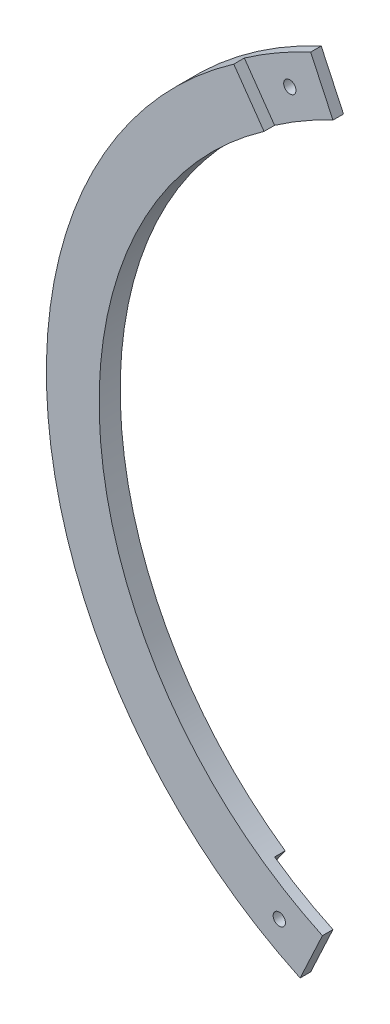
ISO-10303-21;
HEADER;
FILE_DESCRIPTION(('STEP AP214'),'2;1');
FILE_NAME('part.step','',(''),(''),'','','');
FILE_SCHEMA(('AUTOMOTIVE_DESIGN { 1 0 10303 214 1 1 1 1 }'));
ENDSEC;
DATA;
#1=APPLICATION_CONTEXT('core data for automotive mechanical design processes');
#2=APPLICATION_PROTOCOL_DEFINITION('international standard','automotive_design',2000,#1);
#3=PRODUCT_CONTEXT('',#1,'mechanical');
#4=PRODUCT('Part','Part','',(#3));
#5=PRODUCT_RELATED_PRODUCT_CATEGORY('part','',(#4));
#6=PRODUCT_DEFINITION_FORMATION('','',#4);
#7=PRODUCT_DEFINITION_CONTEXT('part definition',#1,'design');
#8=PRODUCT_DEFINITION('design','',#6,#7);
#9=PRODUCT_DEFINITION_SHAPE('','',#8);
#10=(LENGTH_UNIT() NAMED_UNIT(*) SI_UNIT(.MILLI.,.METRE.));
#11=(NAMED_UNIT(*) PLANE_ANGLE_UNIT() SI_UNIT($,.RADIAN.));
#12=(NAMED_UNIT(*) SI_UNIT($,.STERADIAN.) SOLID_ANGLE_UNIT());
#13=UNCERTAINTY_MEASURE_WITH_UNIT(LENGTH_MEASURE(1.E-05),#10,'distance_accuracy_value','');
#14=(GEOMETRIC_REPRESENTATION_CONTEXT(3) GLOBAL_UNCERTAINTY_ASSIGNED_CONTEXT((#13)) GLOBAL_UNIT_ASSIGNED_CONTEXT((#10,
#11,#12)) REPRESENTATION_CONTEXT('',''));
#15=CARTESIAN_POINT('',(0.,0.,0.));
#16=DIRECTION('',(0.,0.,1.));
#17=DIRECTION('',(1.,0.,0.));
#18=AXIS2_PLACEMENT_3D('',#15,#16,#17);
#19=CARTESIAN_POINT('',(0.,0.,6.));
#20=DIRECTION('',(0.,0.,-1.));
#21=DIRECTION('',(-1.,0.,0.));
#22=AXIS2_PLACEMENT_3D('',#19,#20,#21);
#23=CYLINDRICAL_SURFACE('',#22,125.);
#24=CARTESIAN_POINT('',(0.,0.,0.));
#25=DIRECTION('',(0.,0.,1.));
#26=DIRECTION('',(1.,0.,0.));
#27=AXIS2_PLACEMENT_3D('',#24,#25,#26);
#28=CIRCLE('',#27,125.);
#29=CARTESIAN_POINT('',(-52.827282717588,113.288473379581,0.));
#30=VERTEX_POINT('',#29);
#31=CARTESIAN_POINT('',(-71.6970545438808,-102.394005536124,0.));
#32=VERTEX_POINT('',#31);
#33=EDGE_CURVE('E136',#30,#32,#28,.T.);
#34=ORIENTED_EDGE('',*,*,#33,.T.);
#35=DIRECTION('',(0.,0.,-1.));
#36=VECTOR('',#35,1.);
#37=CARTESIAN_POINT('',(-71.6970545438808,-102.394005536124,3.));
#38=LINE('',#37,#36);
#39=CARTESIAN_POINT('',(-71.6970545438808,-102.394005536124,3.));
#40=VERTEX_POINT('',#39);
#41=EDGE_CURVE('E52',#40,#32,#38,.T.);
#42=ORIENTED_EDGE('',*,*,#41,.F.);
#43=CARTESIAN_POINT('',(0.,0.,3.));
#44=DIRECTION('',(0.,0.,-1.));
#45=DIRECTION('',(1.,0.,0.));
#46=AXIS2_PLACEMENT_3D('',#43,#44,#45);
#47=CIRCLE('',#46,125.);
#48=CARTESIAN_POINT('',(-52.827282717588,-113.288473379581,3.));
#49=VERTEX_POINT('',#48);
#50=EDGE_CURVE('E121',#49,#40,#47,.T.);
#51=ORIENTED_EDGE('',*,*,#50,.F.);
#52=DIRECTION('',(0.,0.,-1.));
#53=VECTOR('',#52,1.);
#54=CARTESIAN_POINT('',(-52.8272827175879,-113.288473379581,6.));
#55=LINE('',#54,#53);
#56=CARTESIAN_POINT('',(-52.8272827175879,-113.288473379581,6.));
#57=VERTEX_POINT('',#56);
#58=EDGE_CURVE('E11',#57,#49,#55,.T.);
#59=ORIENTED_EDGE('',*,*,#58,.F.);
#60=CARTESIAN_POINT('',(0.,0.,6.));
#61=DIRECTION('',(0.,0.,1.));
#62=DIRECTION('',(1.,0.,0.));
#63=AXIS2_PLACEMENT_3D('',#60,#61,#62);
#64=CIRCLE('',#63,125.);
#65=CARTESIAN_POINT('',(-71.6970545438815,102.394005536123,6.));
#66=VERTEX_POINT('',#65);
#67=EDGE_CURVE('E153',#66,#57,#64,.T.);
#68=ORIENTED_EDGE('',*,*,#67,.F.);
#69=DIRECTION('',(0.,0.,1.));
#70=VECTOR('',#69,1.);
#71=CARTESIAN_POINT('',(-71.6970545438814,102.394005536124,3.));
#72=LINE('',#71,#70);
#73=CARTESIAN_POINT('',(-71.6970545438814,102.394005536124,3.));
#74=VERTEX_POINT('',#73);
#75=EDGE_CURVE('E60',#74,#66,#72,.T.);
#76=ORIENTED_EDGE('',*,*,#75,.F.);
#77=CARTESIAN_POINT('',(0.,0.,3.));
#78=DIRECTION('',(0.,0.,1.));
#79=DIRECTION('',(-1.,0.,0.));
#80=AXIS2_PLACEMENT_3D('',#77,#78,#79);
#81=CIRCLE('',#80,125.);
#82=CARTESIAN_POINT('',(-52.827282717588,113.288473379581,3.));
#83=VERTEX_POINT('',#82);
#84=EDGE_CURVE('E169',#83,#74,#81,.T.);
#85=ORIENTED_EDGE('',*,*,#84,.F.);
#86=DIRECTION('',(0.,0.,-1.));
#87=VECTOR('',#86,1.);
#88=CARTESIAN_POINT('',(-52.827282717588,113.288473379581,6.));
#89=LINE('',#88,#87);
#90=EDGE_CURVE('E130',#83,#30,#89,.T.);
#91=ORIENTED_EDGE('',*,*,#90,.T.);
#92=EDGE_LOOP('',(#34,#42,#51,#59,#68,#76,#85,#91));
#93=FACE_BOUND('',#92,.T.);
#94=ADVANCED_FACE('F36',(#93),#23,.T.);
#95=CARTESIAN_POINT('',(-46.4880087914774,-99.6938565740313,6.));
#96=DIRECTION('',(-0.906307787036648,0.422618261740704,0.));
#97=DIRECTION('',(-0.422618261740704,-0.906307787036648,0.));
#98=AXIS2_PLACEMENT_3D('',#95,#96,#97);
#99=PLANE('',#98);
#100=ORIENTED_EDGE('',*,*,#58,.T.);
#101=DIRECTION('',(-0.422618261740699,-0.90630778703665,0.));
#102=VECTOR('',#101,1.);
#103=CARTESIAN_POINT('',(-46.4880087914774,-99.6938565740313,3.));
#104=LINE('',#103,#102);
#105=CARTESIAN_POINT('',(-46.4880087914774,-99.6938565740313,3.));
#106=VERTEX_POINT('',#105);
#107=EDGE_CURVE('E107',#106,#49,#104,.T.);
#108=ORIENTED_EDGE('',*,*,#107,.F.);
#109=DIRECTION('',(0.,0.,-1.));
#110=VECTOR('',#109,1.);
#111=CARTESIAN_POINT('',(-46.4880087914774,-99.6938565740313,6.));
#112=LINE('',#111,#110);
#113=CARTESIAN_POINT('',(-46.4880087914774,-99.6938565740313,6.));
#114=VERTEX_POINT('',#113);
#115=EDGE_CURVE('E44',#114,#106,#112,.T.);
#116=ORIENTED_EDGE('',*,*,#115,.F.);
#117=DIRECTION('',(0.422618261740704,0.906307787036648,0.));
#118=VECTOR('',#117,1.);
#119=CARTESIAN_POINT('',(-46.4880087914774,-99.6938565740313,6.));
#120=LINE('',#119,#118);
#121=EDGE_CURVE('E155',#57,#114,#120,.T.);
#122=ORIENTED_EDGE('',*,*,#121,.F.);
#123=EDGE_LOOP('',(#100,#108,#116,#122));
#124=FACE_BOUND('',#123,.T.);
#125=ADVANCED_FACE('F117',(#124),#99,.F.);
#126=CARTESIAN_POINT('',(0.,0.,6.));
#127=DIRECTION('',(0.,0.,-1.));
#128=DIRECTION('',(-1.,0.,0.));
#129=AXIS2_PLACEMENT_3D('',#126,#127,#128);
#130=CYLINDRICAL_SURFACE('',#129,110.);
#131=CARTESIAN_POINT('',(0.,0.,3.));
#132=DIRECTION('',(0.,0.,1.));
#133=DIRECTION('',(1.,0.,0.));
#134=AXIS2_PLACEMENT_3D('',#131,#132,#133);
#135=CIRCLE('',#134,110.);
#136=CARTESIAN_POINT('',(-63.0934079986151,-90.1067248717891,3.));
#137=VERTEX_POINT('',#136);
#138=EDGE_CURVE('E103',#137,#106,#135,.T.);
#139=ORIENTED_EDGE('',*,*,#138,.F.);
#140=DIRECTION('',(0.,0.,-1.));
#141=VECTOR('',#140,1.);
#142=CARTESIAN_POINT('',(-63.0934079986151,-90.1067248717891,3.));
#143=LINE('',#142,#141);
#144=CARTESIAN_POINT('',(-63.0934079986151,-90.1067248717891,0.));
#145=VERTEX_POINT('',#144);
#146=EDGE_CURVE('E179',#137,#145,#143,.T.);
#147=ORIENTED_EDGE('',*,*,#146,.T.);
#148=CARTESIAN_POINT('',(0.,0.,0.));
#149=DIRECTION('',(0.,0.,-1.));
#150=DIRECTION('',(1.,0.,0.));
#151=AXIS2_PLACEMENT_3D('',#148,#149,#150);
#152=CIRCLE('',#151,110.);
#153=CARTESIAN_POINT('',(-46.4880087914775,99.6938565740312,0.));
#154=VERTEX_POINT('',#153);
#155=EDGE_CURVE('E161',#145,#154,#152,.T.);
#156=ORIENTED_EDGE('',*,*,#155,.T.);
#157=DIRECTION('',(0.,0.,-1.));
#158=VECTOR('',#157,1.);
#159=CARTESIAN_POINT('',(-46.4880087914775,99.6938565740312,6.));
#160=LINE('',#159,#158);
#161=CARTESIAN_POINT('',(-46.4880087914775,99.6938565740312,3.));
#162=VERTEX_POINT('',#161);
#163=EDGE_CURVE('E127',#162,#154,#160,.T.);
#164=ORIENTED_EDGE('',*,*,#163,.F.);
#165=CARTESIAN_POINT('',(0.,0.,3.));
#166=DIRECTION('',(0.,0.,-1.));
#167=DIRECTION('',(1.,0.,0.));
#168=AXIS2_PLACEMENT_3D('',#165,#166,#167);
#169=CIRCLE('',#168,110.);
#170=CARTESIAN_POINT('',(-63.0934079986156,90.1067248717887,3.));
#171=VERTEX_POINT('',#170);
#172=EDGE_CURVE('E178',#171,#162,#169,.T.);
#173=ORIENTED_EDGE('',*,*,#172,.F.);
#174=DIRECTION('',(0.,0.,1.));
#175=VECTOR('',#174,1.);
#176=CARTESIAN_POINT('',(-63.0934079986156,90.1067248717887,3.));
#177=LINE('',#176,#175);
#178=CARTESIAN_POINT('',(-63.0934079986156,90.1067248717887,6.));
#179=VERTEX_POINT('',#178);
#180=EDGE_CURVE('E140',#171,#179,#177,.T.);
#181=ORIENTED_EDGE('',*,*,#180,.T.);
#182=CARTESIAN_POINT('',(0.,0.,6.));
#183=DIRECTION('',(0.,0.,-1.));
#184=DIRECTION('',(1.,0.,0.));
#185=AXIS2_PLACEMENT_3D('',#182,#183,#184);
#186=CIRCLE('',#185,110.);
#187=EDGE_CURVE('E126',#114,#179,#186,.T.);
#188=ORIENTED_EDGE('',*,*,#187,.F.);
#189=ORIENTED_EDGE('',*,*,#115,.T.);
#190=EDGE_LOOP('',(#139,#147,#156,#164,#173,#181,#188,#189));
#191=FACE_BOUND('',#190,.T.);
#192=ADVANCED_FACE('F123',(#191),#130,.F.);
#193=CARTESIAN_POINT('',(-46.4880087914775,99.6938565740312,6.));
#194=DIRECTION('',(-0.906307787036648,-0.422618261740704,0.));
#195=DIRECTION('',(0.422618261740704,-0.906307787036648,0.));
#196=AXIS2_PLACEMENT_3D('',#193,#194,#195);
#197=PLANE('',#196);
#198=ORIENTED_EDGE('',*,*,#90,.F.);
#199=DIRECTION('',(-0.422618261740704,0.906307787036648,0.));
#200=VECTOR('',#199,1.);
#201=CARTESIAN_POINT('',(-52.827282717588,113.288473379581,3.));
#202=LINE('',#201,#200);
#203=EDGE_CURVE('E147',#162,#83,#202,.T.);
#204=ORIENTED_EDGE('',*,*,#203,.F.);
#205=ORIENTED_EDGE('',*,*,#163,.T.);
#206=DIRECTION('',(-0.422618261740704,0.906307787036648,0.));
#207=VECTOR('',#206,1.);
#208=CARTESIAN_POINT('',(-46.4880087914775,99.6938565740312,0.));
#209=LINE('',#208,#207);
#210=EDGE_CURVE('E156',#154,#30,#209,.T.);
#211=ORIENTED_EDGE('',*,*,#210,.T.);
#212=EDGE_LOOP('',(#198,#204,#205,#211));
#213=FACE_BOUND('',#212,.T.);
#214=ADVANCED_FACE('F176',(#213),#197,.F.);
#215=CARTESIAN_POINT('',(0.,0.,6.));
#216=DIRECTION('',(0.,0.,1.));
#217=DIRECTION('',(1.,0.,0.));
#218=AXIS2_PLACEMENT_3D('',#215,#216,#217);
#219=PLANE('',#218);
#220=DIRECTION('',(0.573576436351052,-0.819152044288988,0.));
#221=VECTOR('',#220,1.);
#222=CARTESIAN_POINT('',(-71.6970545438814,102.394005536124,6.));
#223=LINE('',#222,#221);
#224=EDGE_CURVE('E150',#66,#179,#223,.T.);
#225=ORIENTED_EDGE('',*,*,#224,.F.);
#226=ORIENTED_EDGE('',*,*,#67,.T.);
#227=ORIENTED_EDGE('',*,*,#121,.T.);
#228=ORIENTED_EDGE('',*,*,#187,.T.);
#229=EDGE_LOOP('',(#225,#226,#227,#228));
#230=FACE_BOUND('',#229,.T.);
#231=CARTESIAN_POINT('',(-58.7499999999997,-101.757984944672,6.));
#232=DIRECTION('',(0.,0.,1.));
#233=DIRECTION('',(1.,0.,0.));
#234=AXIS2_PLACEMENT_3D('',#231,#232,#233);
#235=CIRCLE('',#234,1.75000000000002);
#236=CARTESIAN_POINT('',(-56.9999999999997,-101.757984944672,6.));
#237=VERTEX_POINT('',#236);
#238=EDGE_CURVE('E137',#237,#237,#235,.T.);
#239=ORIENTED_EDGE('',*,*,#238,.F.);
#240=EDGE_LOOP('',(#239));
#241=FACE_BOUND('',#240,.T.);
#242=ADVANCED_FACE('F196',(#230,#241),#219,.T.);
#243=CARTESIAN_POINT('',(0.,0.,0.));
#244=DIRECTION('',(0.,0.,1.));
#245=DIRECTION('',(1.,0.,0.));
#246=AXIS2_PLACEMENT_3D('',#243,#244,#245);
#247=PLANE('',#246);
#248=CARTESIAN_POINT('',(-58.7500000000006,101.757984944671,0.));
#249=DIRECTION('',(0.,0.,1.));
#250=DIRECTION('',(1.,0.,0.));
#251=AXIS2_PLACEMENT_3D('',#248,#249,#250);
#252=CIRCLE('',#251,1.75000000000002);
#253=CARTESIAN_POINT('',(-57.0000000000005,101.757984944671,0.));
#254=VERTEX_POINT('',#253);
#255=EDGE_CURVE('E134',#254,#254,#252,.T.);
#256=ORIENTED_EDGE('',*,*,#255,.T.);
#257=EDGE_LOOP('',(#256));
#258=FACE_BOUND('',#257,.T.);
#259=ORIENTED_EDGE('',*,*,#155,.F.);
#260=DIRECTION('',(0.573576436351047,0.819152044288991,0.));
#261=VECTOR('',#260,1.);
#262=CARTESIAN_POINT('',(-63.0934079986151,-90.1067248717891,0.));
#263=LINE('',#262,#261);
#264=EDGE_CURVE('E113',#32,#145,#263,.T.);
#265=ORIENTED_EDGE('',*,*,#264,.F.);
#266=ORIENTED_EDGE('',*,*,#33,.F.);
#267=ORIENTED_EDGE('',*,*,#210,.F.);
#268=EDGE_LOOP('',(#259,#265,#266,#267));
#269=FACE_BOUND('',#268,.T.);
#270=ADVANCED_FACE('F175',(#258,#269),#247,.F.);
#271=CARTESIAN_POINT('',(-58.7499999999997,-101.757984944672,-4.));
#272=DIRECTION('',(0.,0.,1.));
#273=DIRECTION('',(1.,0.,0.));
#274=AXIS2_PLACEMENT_3D('',#271,#272,#273);
#275=CYLINDRICAL_SURFACE('',#274,1.75000000000002);
#276=CARTESIAN_POINT('',(-58.7499999999997,-101.757984944672,3.));
#277=DIRECTION('',(0.,0.,1.));
#278=DIRECTION('',(1.,0.,0.));
#279=AXIS2_PLACEMENT_3D('',#276,#277,#278);
#280=CIRCLE('',#279,1.75000000000002);
#281=CARTESIAN_POINT('',(-56.9999999999997,-101.757984944672,3.));
#282=VERTEX_POINT('',#281);
#283=EDGE_CURVE('E39',#282,#282,#280,.F.);
#284=ORIENTED_EDGE('',*,*,#283,.T.);
#285=EDGE_LOOP('',(#284));
#286=FACE_BOUND('',#285,.T.);
#287=ORIENTED_EDGE('',*,*,#238,.T.);
#288=EDGE_LOOP('',(#287));
#289=FACE_BOUND('',#288,.T.);
#290=ADVANCED_FACE('F220',(#286,#289),#275,.F.);
#291=CARTESIAN_POINT('',(-58.7500000000006,101.757984944671,-4.));
#292=DIRECTION('',(0.,0.,1.));
#293=DIRECTION('',(1.,0.,0.));
#294=AXIS2_PLACEMENT_3D('',#291,#292,#293);
#295=CYLINDRICAL_SURFACE('',#294,1.75000000000002);
#296=CARTESIAN_POINT('',(-58.7500000000006,101.757984944671,3.));
#297=DIRECTION('',(0.,0.,-1.));
#298=DIRECTION('',(-1.,0.,0.));
#299=AXIS2_PLACEMENT_3D('',#296,#297,#298);
#300=CIRCLE('',#299,1.75000000000002);
#301=CARTESIAN_POINT('',(-60.5000000000006,101.757984944671,3.));
#302=VERTEX_POINT('',#301);
#303=EDGE_CURVE('E138',#302,#302,#300,.F.);
#304=ORIENTED_EDGE('',*,*,#303,.T.);
#305=EDGE_LOOP('',(#304));
#306=FACE_BOUND('',#305,.T.);
#307=ORIENTED_EDGE('',*,*,#255,.F.);
#308=EDGE_LOOP('',(#307));
#309=FACE_BOUND('',#308,.T.);
#310=ADVANCED_FACE('F226',(#306,#309),#295,.F.);
#311=CARTESIAN_POINT('',(0.,0.,3.));
#312=DIRECTION('',(0.,0.,-1.));
#313=DIRECTION('',(-1.,0.,0.));
#314=AXIS2_PLACEMENT_3D('',#311,#312,#313);
#315=PLANE('',#314);
#316=ORIENTED_EDGE('',*,*,#84,.T.);
#317=DIRECTION('',(0.573576436351052,-0.819152044288988,0.));
#318=VECTOR('',#317,1.);
#319=CARTESIAN_POINT('',(-71.6970545438814,102.394005536124,3.));
#320=LINE('',#319,#318);
#321=EDGE_CURVE('E187',#74,#171,#320,.T.);
#322=ORIENTED_EDGE('',*,*,#321,.T.);
#323=ORIENTED_EDGE('',*,*,#172,.T.);
#324=ORIENTED_EDGE('',*,*,#203,.T.);
#325=EDGE_LOOP('',(#316,#322,#323,#324));
#326=FACE_BOUND('',#325,.T.);
#327=ORIENTED_EDGE('',*,*,#303,.F.);
#328=EDGE_LOOP('',(#327));
#329=FACE_BOUND('',#328,.T.);
#330=ADVANCED_FACE('F191',(#326,#329),#315,.F.);
#331=CARTESIAN_POINT('',(-71.6970545438814,102.394005536124,3.));
#332=DIRECTION('',(-0.819152044288988,-0.573576436351052,0.));
#333=DIRECTION('',(0.573576436351052,-0.819152044288988,0.));
#334=AXIS2_PLACEMENT_3D('',#331,#332,#333);
#335=PLANE('',#334);
#336=ORIENTED_EDGE('',*,*,#224,.T.);
#337=ORIENTED_EDGE('',*,*,#180,.F.);
#338=ORIENTED_EDGE('',*,*,#321,.F.);
#339=ORIENTED_EDGE('',*,*,#75,.T.);
#340=EDGE_LOOP('',(#336,#337,#338,#339));
#341=FACE_BOUND('',#340,.T.);
#342=ADVANCED_FACE('F193',(#341),#335,.F.);
#343=CARTESIAN_POINT('',(0.,0.,3.));
#344=DIRECTION('',(0.,0.,1.));
#345=DIRECTION('',(1.,0.,0.));
#346=AXIS2_PLACEMENT_3D('',#343,#344,#345);
#347=PLANE('',#346);
#348=ORIENTED_EDGE('',*,*,#138,.T.);
#349=ORIENTED_EDGE('',*,*,#107,.T.);
#350=ORIENTED_EDGE('',*,*,#50,.T.);
#351=DIRECTION('',(0.573576436351047,0.819152044288991,0.));
#352=VECTOR('',#351,1.);
#353=CARTESIAN_POINT('',(-63.0934079986151,-90.1067248717891,3.));
#354=LINE('',#353,#352);
#355=EDGE_CURVE('E109',#40,#137,#354,.T.);
#356=ORIENTED_EDGE('',*,*,#355,.T.);
#357=EDGE_LOOP('',(#348,#349,#350,#356));
#358=FACE_BOUND('',#357,.T.);
#359=ORIENTED_EDGE('',*,*,#283,.F.);
#360=EDGE_LOOP('',(#359));
#361=FACE_BOUND('',#360,.T.);
#362=ADVANCED_FACE('F105',(#358,#361),#347,.F.);
#363=CARTESIAN_POINT('',(-63.0934079986151,-90.1067248717891,3.));
#364=DIRECTION('',(-0.819152044288991,0.573576436351047,0.));
#365=DIRECTION('',(-0.573576436351047,-0.819152044288991,0.));
#366=AXIS2_PLACEMENT_3D('',#363,#364,#365);
#367=PLANE('',#366);
#368=ORIENTED_EDGE('',*,*,#264,.T.);
#369=ORIENTED_EDGE('',*,*,#146,.F.);
#370=ORIENTED_EDGE('',*,*,#355,.F.);
#371=ORIENTED_EDGE('',*,*,#41,.T.);
#372=EDGE_LOOP('',(#368,#369,#370,#371));
#373=FACE_BOUND('',#372,.T.);
#374=ADVANCED_FACE('F199',(#373),#367,.F.);
#375=CLOSED_SHELL('',(#94,#125,#192,#214,#242,#270,#290,#310,#330,#342,#362,#374));
#376=MANIFOLD_SOLID_BREP('B2',#375);
#377=ADVANCED_BREP_SHAPE_REPRESENTATION('',(#18,#376),#14);
#378=SHAPE_DEFINITION_REPRESENTATION(#9,#377);
ENDSEC;
END-ISO-10303-21;
